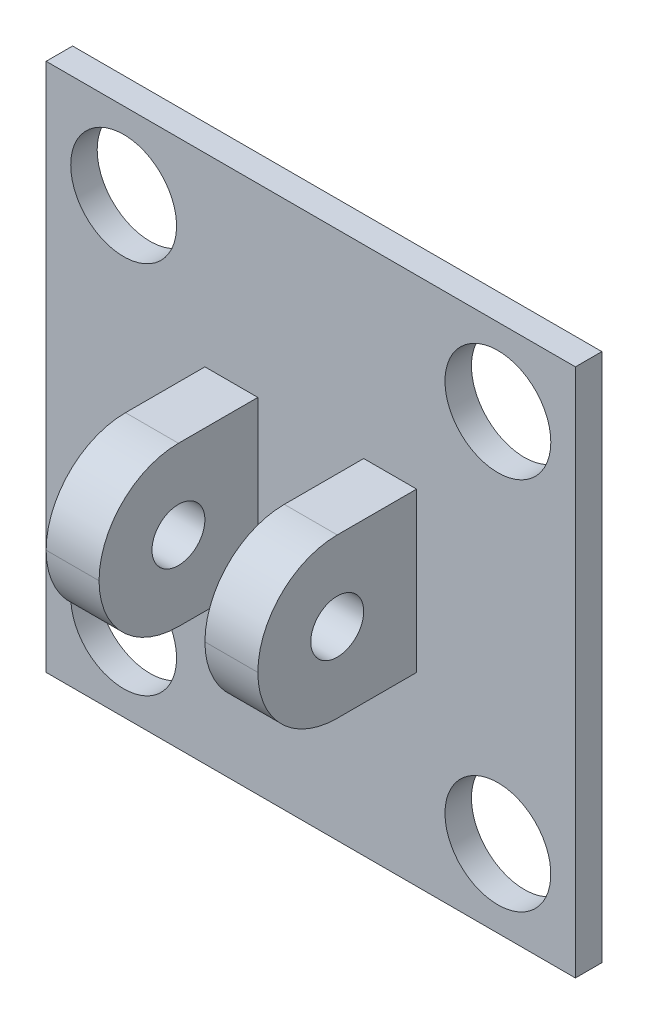
ISO-10303-21;
HEADER;
FILE_DESCRIPTION(('STEP AP214'),'2;1');
FILE_NAME('part.step','',(''),(''),'','','');
FILE_SCHEMA(('AUTOMOTIVE_DESIGN { 1 0 10303 214 1 1 1 1 }'));
ENDSEC;
DATA;
#1=APPLICATION_CONTEXT('core data for automotive mechanical design processes');
#2=APPLICATION_PROTOCOL_DEFINITION('international standard','automotive_design',2000,#1);
#3=PRODUCT_CONTEXT('',#1,'mechanical');
#4=PRODUCT('Part','Part','',(#3));
#5=PRODUCT_RELATED_PRODUCT_CATEGORY('part','',(#4));
#6=PRODUCT_DEFINITION_FORMATION('','',#4);
#7=PRODUCT_DEFINITION_CONTEXT('part definition',#1,'design');
#8=PRODUCT_DEFINITION('design','',#6,#7);
#9=PRODUCT_DEFINITION_SHAPE('','',#8);
#10=(LENGTH_UNIT() NAMED_UNIT(*) SI_UNIT(.MILLI.,.METRE.));
#11=(NAMED_UNIT(*) PLANE_ANGLE_UNIT() SI_UNIT($,.RADIAN.));
#12=(NAMED_UNIT(*) SI_UNIT($,.STERADIAN.) SOLID_ANGLE_UNIT());
#13=UNCERTAINTY_MEASURE_WITH_UNIT(LENGTH_MEASURE(1.E-05),#10,'distance_accuracy_value','');
#14=(GEOMETRIC_REPRESENTATION_CONTEXT(3) GLOBAL_UNCERTAINTY_ASSIGNED_CONTEXT((#13)) GLOBAL_UNIT_ASSIGNED_CONTEXT((#10,
#11,#12)) REPRESENTATION_CONTEXT('',''));
#15=CARTESIAN_POINT('',(0.,0.,0.));
#16=DIRECTION('',(0.,0.,1.));
#17=DIRECTION('',(1.,0.,0.));
#18=AXIS2_PLACEMENT_3D('',#15,#16,#17);
#19=CARTESIAN_POINT('',(0.,0.,2.5));
#20=DIRECTION('',(0.,0.,-1.));
#21=DIRECTION('',(-1.,0.,0.));
#22=AXIS2_PLACEMENT_3D('',#19,#20,#21);
#23=PLANE('',#22);
#24=DIRECTION('',(1.,0.,0.));
#25=VECTOR('',#24,1.);
#26=CARTESIAN_POINT('',(0.,-7.5,2.5));
#27=LINE('',#26,#25);
#28=CARTESIAN_POINT('',(5.,-7.5,2.5));
#29=VERTEX_POINT('',#28);
#30=CARTESIAN_POINT('',(10.,-7.5,2.5));
#31=VERTEX_POINT('',#30);
#32=EDGE_CURVE('E146',#29,#31,#27,.T.);
#33=ORIENTED_EDGE('',*,*,#32,.F.);
#34=DIRECTION('',(0.,1.,0.));
#35=VECTOR('',#34,1.);
#36=CARTESIAN_POINT('',(5.,0.,2.5));
#37=LINE('',#36,#35);
#38=CARTESIAN_POINT('',(5.,7.5,2.5));
#39=VERTEX_POINT('',#38);
#40=EDGE_CURVE('E155',#29,#39,#37,.T.);
#41=ORIENTED_EDGE('',*,*,#40,.T.);
#42=DIRECTION('',(1.,0.,0.));
#43=VECTOR('',#42,1.);
#44=CARTESIAN_POINT('',(0.,7.5,2.5));
#45=LINE('',#44,#43);
#46=CARTESIAN_POINT('',(10.,7.5,2.5));
#47=VERTEX_POINT('',#46);
#48=EDGE_CURVE('E170',#39,#47,#45,.T.);
#49=ORIENTED_EDGE('',*,*,#48,.T.);
#50=DIRECTION('',(0.,1.,0.));
#51=VECTOR('',#50,1.);
#52=CARTESIAN_POINT('',(10.,0.,2.5));
#53=LINE('',#52,#51);
#54=EDGE_CURVE('E166',#31,#47,#53,.T.);
#55=ORIENTED_EDGE('',*,*,#54,.F.);
#56=EDGE_LOOP('',(#33,#41,#49,#55));
#57=FACE_BOUND('',#56,.T.);
#58=CARTESIAN_POINT('',(-17.6776695296637,-17.6776695296637,2.5));
#59=DIRECTION('',(0.,0.,1.));
#60=DIRECTION('',(1.,0.,0.));
#61=AXIS2_PLACEMENT_3D('',#58,#59,#60);
#62=CIRCLE('',#61,5.);
#63=CARTESIAN_POINT('',(-12.6776695296637,-17.6776695296637,2.5));
#64=VERTEX_POINT('',#63);
#65=EDGE_CURVE('E211',#64,#64,#62,.T.);
#66=ORIENTED_EDGE('',*,*,#65,.F.);
#67=EDGE_LOOP('',(#66));
#68=FACE_BOUND('',#67,.T.);
#69=CARTESIAN_POINT('',(17.6776695296637,-17.6776695296637,2.5));
#70=DIRECTION('',(0.,0.,1.));
#71=DIRECTION('',(-1.,0.,0.));
#72=AXIS2_PLACEMENT_3D('',#69,#70,#71);
#73=CIRCLE('',#72,5.);
#74=CARTESIAN_POINT('',(12.6776695296637,-17.6776695296637,2.5));
#75=VERTEX_POINT('',#74);
#76=EDGE_CURVE('E219',#75,#75,#73,.T.);
#77=ORIENTED_EDGE('',*,*,#76,.F.);
#78=EDGE_LOOP('',(#77));
#79=FACE_BOUND('',#78,.T.);
#80=CARTESIAN_POINT('',(-17.6776695296637,17.6776695296637,2.5));
#81=DIRECTION('',(0.,0.,1.));
#82=DIRECTION('',(-1.,0.,0.));
#83=AXIS2_PLACEMENT_3D('',#80,#81,#82);
#84=CIRCLE('',#83,5.);
#85=CARTESIAN_POINT('',(-22.6776695296637,17.6776695296637,2.5));
#86=VERTEX_POINT('',#85);
#87=EDGE_CURVE('E227',#86,#86,#84,.T.);
#88=ORIENTED_EDGE('',*,*,#87,.F.);
#89=EDGE_LOOP('',(#88));
#90=FACE_BOUND('',#89,.T.);
#91=CARTESIAN_POINT('',(17.6776695296637,17.6776695296637,2.5));
#92=DIRECTION('',(0.,0.,1.));
#93=DIRECTION('',(1.,0.,0.));
#94=AXIS2_PLACEMENT_3D('',#91,#92,#93);
#95=CIRCLE('',#94,5.);
#96=CARTESIAN_POINT('',(22.6776695296637,17.6776695296637,2.5));
#97=VERTEX_POINT('',#96);
#98=EDGE_CURVE('E235',#97,#97,#95,.T.);
#99=ORIENTED_EDGE('',*,*,#98,.F.);
#100=EDGE_LOOP('',(#99));
#101=FACE_BOUND('',#100,.T.);
#102=DIRECTION('',(0.,1.,0.));
#103=VECTOR('',#102,1.);
#104=CARTESIAN_POINT('',(25.,-25.,2.5));
#105=LINE('',#104,#103);
#106=CARTESIAN_POINT('',(25.,-25.,2.5));
#107=VERTEX_POINT('',#106);
#108=CARTESIAN_POINT('',(25.,25.,2.5));
#109=VERTEX_POINT('',#108);
#110=EDGE_CURVE('E243',#107,#109,#105,.T.);
#111=ORIENTED_EDGE('',*,*,#110,.T.);
#112=DIRECTION('',(-1.,0.,0.));
#113=VECTOR('',#112,1.);
#114=CARTESIAN_POINT('',(-25.,25.,2.5));
#115=LINE('',#114,#113);
#116=CARTESIAN_POINT('',(-25.,25.,2.5));
#117=VERTEX_POINT('',#116);
#118=EDGE_CURVE('E247',#109,#117,#115,.T.);
#119=ORIENTED_EDGE('',*,*,#118,.T.);
#120=DIRECTION('',(0.,-1.,0.));
#121=VECTOR('',#120,1.);
#122=CARTESIAN_POINT('',(-25.,-25.,2.5));
#123=LINE('',#122,#121);
#124=CARTESIAN_POINT('',(-25.,-25.,2.5));
#125=VERTEX_POINT('',#124);
#126=EDGE_CURVE('E251',#117,#125,#123,.T.);
#127=ORIENTED_EDGE('',*,*,#126,.T.);
#128=DIRECTION('',(1.,0.,0.));
#129=VECTOR('',#128,1.);
#130=CARTESIAN_POINT('',(-25.,-25.,2.5));
#131=LINE('',#130,#129);
#132=EDGE_CURVE('E254',#125,#107,#131,.T.);
#133=ORIENTED_EDGE('',*,*,#132,.T.);
#134=EDGE_LOOP('',(#111,#119,#127,#133));
#135=FACE_BOUND('',#134,.T.);
#136=DIRECTION('',(1.,0.,0.));
#137=VECTOR('',#136,1.);
#138=CARTESIAN_POINT('',(0.,-7.5,2.5));
#139=LINE('',#138,#137);
#140=CARTESIAN_POINT('',(-10.,-7.5,2.5));
#141=VERTEX_POINT('',#140);
#142=CARTESIAN_POINT('',(-5.,-7.5,2.5));
#143=VERTEX_POINT('',#142);
#144=EDGE_CURVE('E151',#141,#143,#139,.T.);
#145=ORIENTED_EDGE('',*,*,#144,.F.);
#146=DIRECTION('',(0.,1.,0.));
#147=VECTOR('',#146,1.);
#148=CARTESIAN_POINT('',(-10.,0.,2.5));
#149=LINE('',#148,#147);
#150=CARTESIAN_POINT('',(-10.,7.5,2.5));
#151=VERTEX_POINT('',#150);
#152=EDGE_CURVE('E194',#141,#151,#149,.T.);
#153=ORIENTED_EDGE('',*,*,#152,.T.);
#154=DIRECTION('',(1.,0.,0.));
#155=VECTOR('',#154,1.);
#156=CARTESIAN_POINT('',(0.,7.5,2.5));
#157=LINE('',#156,#155);
#158=CARTESIAN_POINT('',(-5.,7.5,2.5));
#159=VERTEX_POINT('',#158);
#160=EDGE_CURVE('E190',#151,#159,#157,.T.);
#161=ORIENTED_EDGE('',*,*,#160,.T.);
#162=DIRECTION('',(0.,1.,0.));
#163=VECTOR('',#162,1.);
#164=CARTESIAN_POINT('',(-5.,0.,2.5));
#165=LINE('',#164,#163);
#166=EDGE_CURVE('E186',#143,#159,#165,.T.);
#167=ORIENTED_EDGE('',*,*,#166,.F.);
#168=EDGE_LOOP('',(#145,#153,#161,#167));
#169=FACE_BOUND('',#168,.T.);
#170=ADVANCED_FACE('F41',(#57,#68,#79,#90,#101,#135,#169),#23,.F.);
#171=CARTESIAN_POINT('',(0.,0.,0.));
#172=DIRECTION('',(0.,0.,-1.));
#173=DIRECTION('',(-1.,0.,0.));
#174=AXIS2_PLACEMENT_3D('',#171,#172,#173);
#175=PLANE('',#174);
#176=CARTESIAN_POINT('',(17.6776695296637,-17.6776695296637,0.));
#177=DIRECTION('',(0.,0.,1.));
#178=DIRECTION('',(-1.,0.,0.));
#179=AXIS2_PLACEMENT_3D('',#176,#177,#178);
#180=CIRCLE('',#179,5.);
#181=CARTESIAN_POINT('',(12.6776695296637,-17.6776695296637,0.));
#182=VERTEX_POINT('',#181);
#183=EDGE_CURVE('E215',#182,#182,#180,.T.);
#184=ORIENTED_EDGE('',*,*,#183,.T.);
#185=EDGE_LOOP('',(#184));
#186=FACE_BOUND('',#185,.T.);
#187=CARTESIAN_POINT('',(17.6776695296637,17.6776695296637,0.));
#188=DIRECTION('',(0.,0.,1.));
#189=DIRECTION('',(1.,0.,0.));
#190=AXIS2_PLACEMENT_3D('',#187,#188,#189);
#191=CIRCLE('',#190,5.);
#192=CARTESIAN_POINT('',(22.6776695296637,17.6776695296637,0.));
#193=VERTEX_POINT('',#192);
#194=EDGE_CURVE('E231',#193,#193,#191,.T.);
#195=ORIENTED_EDGE('',*,*,#194,.T.);
#196=EDGE_LOOP('',(#195));
#197=FACE_BOUND('',#196,.T.);
#198=DIRECTION('',(0.,1.,0.));
#199=VECTOR('',#198,1.);
#200=CARTESIAN_POINT('',(25.,-25.,0.));
#201=LINE('',#200,#199);
#202=CARTESIAN_POINT('',(25.,-25.,0.));
#203=VERTEX_POINT('',#202);
#204=CARTESIAN_POINT('',(25.,25.,0.));
#205=VERTEX_POINT('',#204);
#206=EDGE_CURVE('E239',#203,#205,#201,.T.);
#207=ORIENTED_EDGE('',*,*,#206,.F.);
#208=DIRECTION('',(1.,0.,0.));
#209=VECTOR('',#208,1.);
#210=CARTESIAN_POINT('',(-25.,-25.,0.));
#211=LINE('',#210,#209);
#212=CARTESIAN_POINT('',(-25.,-25.,0.));
#213=VERTEX_POINT('',#212);
#214=EDGE_CURVE('E248',#213,#203,#211,.T.);
#215=ORIENTED_EDGE('',*,*,#214,.F.);
#216=DIRECTION('',(0.,-1.,0.));
#217=VECTOR('',#216,1.);
#218=CARTESIAN_POINT('',(-25.,-25.,0.));
#219=LINE('',#218,#217);
#220=CARTESIAN_POINT('',(-25.,25.,0.));
#221=VERTEX_POINT('',#220);
#222=EDGE_CURVE('E264',#221,#213,#219,.T.);
#223=ORIENTED_EDGE('',*,*,#222,.F.);
#224=DIRECTION('',(-1.,0.,0.));
#225=VECTOR('',#224,1.);
#226=CARTESIAN_POINT('',(-25.,25.,0.));
#227=LINE('',#226,#225);
#228=EDGE_CURVE('E261',#205,#221,#227,.T.);
#229=ORIENTED_EDGE('',*,*,#228,.F.);
#230=EDGE_LOOP('',(#207,#215,#223,#229));
#231=FACE_BOUND('',#230,.T.);
#232=CARTESIAN_POINT('',(-17.6776695296637,17.6776695296637,0.));
#233=DIRECTION('',(0.,0.,1.));
#234=DIRECTION('',(-1.,0.,0.));
#235=AXIS2_PLACEMENT_3D('',#232,#233,#234);
#236=CIRCLE('',#235,5.);
#237=CARTESIAN_POINT('',(-22.6776695296637,17.6776695296637,0.));
#238=VERTEX_POINT('',#237);
#239=EDGE_CURVE('E223',#238,#238,#236,.T.);
#240=ORIENTED_EDGE('',*,*,#239,.T.);
#241=EDGE_LOOP('',(#240));
#242=FACE_BOUND('',#241,.T.);
#243=CARTESIAN_POINT('',(-17.6776695296637,-17.6776695296637,0.));
#244=DIRECTION('',(0.,0.,1.));
#245=DIRECTION('',(1.,0.,0.));
#246=AXIS2_PLACEMENT_3D('',#243,#244,#245);
#247=CIRCLE('',#246,5.);
#248=CARTESIAN_POINT('',(-12.6776695296637,-17.6776695296637,0.));
#249=VERTEX_POINT('',#248);
#250=EDGE_CURVE('E210',#249,#249,#247,.T.);
#251=ORIENTED_EDGE('',*,*,#250,.T.);
#252=EDGE_LOOP('',(#251));
#253=FACE_BOUND('',#252,.T.);
#254=ADVANCED_FACE('F351',(#186,#197,#231,#242,#253),#175,.T.);
#255=CARTESIAN_POINT('',(25.,-25.,2.5));
#256=DIRECTION('',(-1.,0.,0.));
#257=DIRECTION('',(0.,-1.,0.));
#258=AXIS2_PLACEMENT_3D('',#255,#256,#257);
#259=PLANE('',#258);
#260=ORIENTED_EDGE('',*,*,#206,.T.);
#261=DIRECTION('',(0.,0.,-1.));
#262=VECTOR('',#261,1.);
#263=CARTESIAN_POINT('',(25.,25.,2.5));
#264=LINE('',#263,#262);
#265=EDGE_CURVE('E280',#109,#205,#264,.T.);
#266=ORIENTED_EDGE('',*,*,#265,.F.);
#267=ORIENTED_EDGE('',*,*,#110,.F.);
#268=DIRECTION('',(0.,0.,-1.));
#269=VECTOR('',#268,1.);
#270=CARTESIAN_POINT('',(25.,-25.,2.5));
#271=LINE('',#270,#269);
#272=EDGE_CURVE('E257',#107,#203,#271,.T.);
#273=ORIENTED_EDGE('',*,*,#272,.T.);
#274=EDGE_LOOP('',(#260,#266,#267,#273));
#275=FACE_BOUND('',#274,.T.);
#276=ADVANCED_FACE('F356',(#275),#259,.F.);
#277=CARTESIAN_POINT('',(-25.,25.,2.5));
#278=DIRECTION('',(0.,-1.,0.));
#279=DIRECTION('',(1.,0.,0.));
#280=AXIS2_PLACEMENT_3D('',#277,#278,#279);
#281=PLANE('',#280);
#282=ORIENTED_EDGE('',*,*,#228,.T.);
#283=DIRECTION('',(0.,0.,-1.));
#284=VECTOR('',#283,1.);
#285=CARTESIAN_POINT('',(-25.,25.,2.5));
#286=LINE('',#285,#284);
#287=EDGE_CURVE('E276',#117,#221,#286,.T.);
#288=ORIENTED_EDGE('',*,*,#287,.F.);
#289=ORIENTED_EDGE('',*,*,#118,.F.);
#290=ORIENTED_EDGE('',*,*,#265,.T.);
#291=EDGE_LOOP('',(#282,#288,#289,#290));
#292=FACE_BOUND('',#291,.T.);
#293=ADVANCED_FACE('F370',(#292),#281,.F.);
#294=CARTESIAN_POINT('',(-25.,-25.,2.5));
#295=DIRECTION('',(1.,0.,0.));
#296=DIRECTION('',(0.,1.,0.));
#297=AXIS2_PLACEMENT_3D('',#294,#295,#296);
#298=PLANE('',#297);
#299=ORIENTED_EDGE('',*,*,#222,.T.);
#300=DIRECTION('',(0.,0.,-1.));
#301=VECTOR('',#300,1.);
#302=CARTESIAN_POINT('',(-25.,-25.,2.5));
#303=LINE('',#302,#301);
#304=EDGE_CURVE('E272',#125,#213,#303,.T.);
#305=ORIENTED_EDGE('',*,*,#304,.F.);
#306=ORIENTED_EDGE('',*,*,#126,.F.);
#307=ORIENTED_EDGE('',*,*,#287,.T.);
#308=EDGE_LOOP('',(#299,#305,#306,#307));
#309=FACE_BOUND('',#308,.T.);
#310=ADVANCED_FACE('F366',(#309),#298,.F.);
#311=CARTESIAN_POINT('',(-25.,-25.,2.5));
#312=DIRECTION('',(0.,1.,0.));
#313=DIRECTION('',(0.,0.,1.));
#314=AXIS2_PLACEMENT_3D('',#311,#312,#313);
#315=PLANE('',#314);
#316=ORIENTED_EDGE('',*,*,#214,.T.);
#317=ORIENTED_EDGE('',*,*,#272,.F.);
#318=ORIENTED_EDGE('',*,*,#132,.F.);
#319=ORIENTED_EDGE('',*,*,#304,.T.);
#320=EDGE_LOOP('',(#316,#317,#318,#319));
#321=FACE_BOUND('',#320,.T.);
#322=ADVANCED_FACE('F363',(#321),#315,.F.);
#323=CARTESIAN_POINT('',(17.6776695296637,17.6776695296637,2.5));
#324=DIRECTION('',(0.,0.,-1.));
#325=DIRECTION('',(-1.,0.,0.));
#326=AXIS2_PLACEMENT_3D('',#323,#324,#325);
#327=CYLINDRICAL_SURFACE('',#326,5.);
#328=ORIENTED_EDGE('',*,*,#98,.T.);
#329=EDGE_LOOP('',(#328));
#330=FACE_BOUND('',#329,.T.);
#331=ORIENTED_EDGE('',*,*,#194,.F.);
#332=EDGE_LOOP('',(#331));
#333=FACE_BOUND('',#332,.T.);
#334=ADVANCED_FACE('F360',(#330,#333),#327,.F.);
#335=CARTESIAN_POINT('',(-17.6776695296637,17.6776695296637,2.5));
#336=DIRECTION('',(0.,0.,-1.));
#337=DIRECTION('',(-1.,0.,0.));
#338=AXIS2_PLACEMENT_3D('',#335,#336,#337);
#339=CYLINDRICAL_SURFACE('',#338,5.);
#340=ORIENTED_EDGE('',*,*,#87,.T.);
#341=EDGE_LOOP('',(#340));
#342=FACE_BOUND('',#341,.T.);
#343=ORIENTED_EDGE('',*,*,#239,.F.);
#344=EDGE_LOOP('',(#343));
#345=FACE_BOUND('',#344,.T.);
#346=ADVANCED_FACE('F493',(#342,#345),#339,.F.);
#347=CARTESIAN_POINT('',(17.6776695296637,-17.6776695296637,2.5));
#348=DIRECTION('',(0.,0.,-1.));
#349=DIRECTION('',(-1.,0.,0.));
#350=AXIS2_PLACEMENT_3D('',#347,#348,#349);
#351=CYLINDRICAL_SURFACE('',#350,5.);
#352=ORIENTED_EDGE('',*,*,#76,.T.);
#353=EDGE_LOOP('',(#352));
#354=FACE_BOUND('',#353,.T.);
#355=ORIENTED_EDGE('',*,*,#183,.F.);
#356=EDGE_LOOP('',(#355));
#357=FACE_BOUND('',#356,.T.);
#358=ADVANCED_FACE('F485',(#354,#357),#351,.F.);
#359=CARTESIAN_POINT('',(-17.6776695296637,-17.6776695296637,2.5));
#360=DIRECTION('',(0.,0.,-1.));
#361=DIRECTION('',(-1.,0.,0.));
#362=AXIS2_PLACEMENT_3D('',#359,#360,#361);
#363=CYLINDRICAL_SURFACE('',#362,5.);
#364=ORIENTED_EDGE('',*,*,#65,.T.);
#365=EDGE_LOOP('',(#364));
#366=FACE_BOUND('',#365,.T.);
#367=ORIENTED_EDGE('',*,*,#250,.F.);
#368=EDGE_LOOP('',(#367));
#369=FACE_BOUND('',#368,.T.);
#370=ADVANCED_FACE('F474',(#366,#369),#363,.F.);
#371=CARTESIAN_POINT('',(0.,-7.5,17.5));
#372=DIRECTION('',(0.,1.,0.));
#373=DIRECTION('',(0.,0.,1.));
#374=AXIS2_PLACEMENT_3D('',#371,#372,#373);
#375=PLANE('',#374);
#376=DIRECTION('',(0.,0.,-1.));
#377=VECTOR('',#376,1.);
#378=CARTESIAN_POINT('',(-5.,-7.5,17.5));
#379=LINE('',#378,#377);
#380=CARTESIAN_POINT('',(-5.,-7.5,10.));
#381=VERTEX_POINT('',#380);
#382=EDGE_CURVE('E207',#381,#143,#379,.T.);
#383=ORIENTED_EDGE('',*,*,#382,.F.);
#384=DIRECTION('',(1.,0.,0.));
#385=VECTOR('',#384,1.);
#386=CARTESIAN_POINT('',(-10.,-7.5,10.));
#387=LINE('',#386,#385);
#388=CARTESIAN_POINT('',(-10.,-7.5,10.));
#389=VERTEX_POINT('',#388);
#390=EDGE_CURVE('E300',#381,#389,#387,.F.);
#391=ORIENTED_EDGE('',*,*,#390,.T.);
#392=DIRECTION('',(0.,0.,-1.));
#393=VECTOR('',#392,1.);
#394=CARTESIAN_POINT('',(-10.,-7.5,17.5));
#395=LINE('',#394,#393);
#396=EDGE_CURVE('E198',#389,#141,#395,.T.);
#397=ORIENTED_EDGE('',*,*,#396,.T.);
#398=ORIENTED_EDGE('',*,*,#144,.T.);
#399=EDGE_LOOP('',(#383,#391,#397,#398));
#400=FACE_BOUND('',#399,.T.);
#401=ADVANCED_FACE('F465',(#400),#375,.F.);
#402=CARTESIAN_POINT('',(-5.,0.,17.5));
#403=DIRECTION('',(-1.,0.,0.));
#404=DIRECTION('',(0.,0.,1.));
#405=AXIS2_PLACEMENT_3D('',#402,#403,#404);
#406=PLANE('',#405);
#407=CARTESIAN_POINT('',(-5.,0.,10.));
#408=DIRECTION('',(-1.,0.,0.));
#409=DIRECTION('',(0.,0.,1.));
#410=AXIS2_PLACEMENT_3D('',#407,#408,#409);
#411=CIRCLE('',#410,2.5);
#412=CARTESIAN_POINT('',(-5.,0.,12.5));
#413=VERTEX_POINT('',#412);
#414=EDGE_CURVE('E162',#413,#413,#411,.T.);
#415=ORIENTED_EDGE('',*,*,#414,.T.);
#416=EDGE_LOOP('',(#415));
#417=FACE_BOUND('',#416,.T.);
#418=DIRECTION('',(0.,0.,-1.));
#419=VECTOR('',#418,1.);
#420=CARTESIAN_POINT('',(-5.,7.5,17.5));
#421=LINE('',#420,#419);
#422=CARTESIAN_POINT('',(-5.,7.5,10.));
#423=VERTEX_POINT('',#422);
#424=EDGE_CURVE('E204',#423,#159,#421,.T.);
#425=ORIENTED_EDGE('',*,*,#424,.F.);
#426=CARTESIAN_POINT('',(-5.,0.,10.));
#427=DIRECTION('',(-1.,0.,0.));
#428=DIRECTION('',(0.,0.,1.));
#429=AXIS2_PLACEMENT_3D('',#426,#427,#428);
#430=CIRCLE('',#429,7.5);
#431=CARTESIAN_POINT('',(-5.,0.,17.5));
#432=VERTEX_POINT('',#431);
#433=EDGE_CURVE('E291',#423,#432,#430,.F.);
#434=ORIENTED_EDGE('',*,*,#433,.T.);
#435=CARTESIAN_POINT('',(-5.,0.,10.));
#436=DIRECTION('',(-1.,0.,0.));
#437=DIRECTION('',(0.,0.,1.));
#438=AXIS2_PLACEMENT_3D('',#435,#436,#437);
#439=CIRCLE('',#438,7.5);
#440=EDGE_CURVE('E288',#432,#381,#439,.F.);
#441=ORIENTED_EDGE('',*,*,#440,.T.);
#442=ORIENTED_EDGE('',*,*,#382,.T.);
#443=ORIENTED_EDGE('',*,*,#166,.T.);
#444=EDGE_LOOP('',(#425,#434,#441,#442,#443));
#445=FACE_BOUND('',#444,.T.);
#446=ADVANCED_FACE('F456',(#417,#445),#406,.F.);
#447=CARTESIAN_POINT('',(0.,7.5,17.5));
#448=DIRECTION('',(0.,1.,0.));
#449=DIRECTION('',(0.,0.,1.));
#450=AXIS2_PLACEMENT_3D('',#447,#448,#449);
#451=PLANE('',#450);
#452=DIRECTION('',(0.,0.,-1.));
#453=VECTOR('',#452,1.);
#454=CARTESIAN_POINT('',(-10.,7.5,17.5));
#455=LINE('',#454,#453);
#456=CARTESIAN_POINT('',(-10.,7.5,10.));
#457=VERTEX_POINT('',#456);
#458=EDGE_CURVE('E201',#457,#151,#455,.T.);
#459=ORIENTED_EDGE('',*,*,#458,.F.);
#460=DIRECTION('',(1.,0.,0.));
#461=VECTOR('',#460,1.);
#462=CARTESIAN_POINT('',(0.,7.5,10.));
#463=LINE('',#462,#461);
#464=EDGE_CURVE('E284',#457,#423,#463,.T.);
#465=ORIENTED_EDGE('',*,*,#464,.T.);
#466=ORIENTED_EDGE('',*,*,#424,.T.);
#467=ORIENTED_EDGE('',*,*,#160,.F.);
#468=EDGE_LOOP('',(#459,#465,#466,#467));
#469=FACE_BOUND('',#468,.T.);
#470=ADVANCED_FACE('F446',(#469),#451,.T.);
#471=CARTESIAN_POINT('',(-10.,0.,17.5));
#472=DIRECTION('',(-1.,0.,0.));
#473=DIRECTION('',(0.,0.,1.));
#474=AXIS2_PLACEMENT_3D('',#471,#472,#473);
#475=PLANE('',#474);
#476=CARTESIAN_POINT('',(-10.,0.,10.));
#477=DIRECTION('',(-1.,0.,0.));
#478=DIRECTION('',(0.,0.,1.));
#479=AXIS2_PLACEMENT_3D('',#476,#477,#478);
#480=CIRCLE('',#479,2.5);
#481=CARTESIAN_POINT('',(-10.,0.,12.5));
#482=VERTEX_POINT('',#481);
#483=EDGE_CURVE('E599',#482,#482,#480,.T.);
#484=ORIENTED_EDGE('',*,*,#483,.F.);
#485=EDGE_LOOP('',(#484));
#486=FACE_BOUND('',#485,.T.);
#487=CARTESIAN_POINT('',(-10.,0.,10.));
#488=DIRECTION('',(-1.,0.,0.));
#489=DIRECTION('',(0.,0.,1.));
#490=AXIS2_PLACEMENT_3D('',#487,#488,#489);
#491=CIRCLE('',#490,7.5);
#492=CARTESIAN_POINT('',(-10.,0.,17.5));
#493=VERTEX_POINT('',#492);
#494=EDGE_CURVE('E294',#389,#493,#491,.T.);
#495=ORIENTED_EDGE('',*,*,#494,.T.);
#496=CARTESIAN_POINT('',(-10.,0.,10.));
#497=DIRECTION('',(-1.,0.,0.));
#498=DIRECTION('',(0.,0.,1.));
#499=AXIS2_PLACEMENT_3D('',#496,#497,#498);
#500=CIRCLE('',#499,7.5);
#501=EDGE_CURVE('E297',#493,#457,#500,.T.);
#502=ORIENTED_EDGE('',*,*,#501,.T.);
#503=ORIENTED_EDGE('',*,*,#458,.T.);
#504=ORIENTED_EDGE('',*,*,#152,.F.);
#505=ORIENTED_EDGE('',*,*,#396,.F.);
#506=EDGE_LOOP('',(#495,#502,#503,#504,#505));
#507=FACE_BOUND('',#506,.T.);
#508=ADVANCED_FACE('F436',(#486,#507),#475,.T.);
#509=CARTESIAN_POINT('',(5.,0.,17.5));
#510=DIRECTION('',(-1.,0.,0.));
#511=DIRECTION('',(0.,0.,1.));
#512=AXIS2_PLACEMENT_3D('',#509,#510,#511);
#513=PLANE('',#512);
#514=CARTESIAN_POINT('',(5.,0.,10.));
#515=DIRECTION('',(-1.,0.,0.));
#516=DIRECTION('',(0.,0.,1.));
#517=AXIS2_PLACEMENT_3D('',#514,#515,#516);
#518=CIRCLE('',#517,2.5);
#519=CARTESIAN_POINT('',(5.,0.,12.5));
#520=VERTEX_POINT('',#519);
#521=EDGE_CURVE('E324',#520,#520,#518,.T.);
#522=ORIENTED_EDGE('',*,*,#521,.F.);
#523=EDGE_LOOP('',(#522));
#524=FACE_BOUND('',#523,.T.);
#525=DIRECTION('',(0.,0.,-1.));
#526=VECTOR('',#525,1.);
#527=CARTESIAN_POINT('',(5.,-7.5,17.5));
#528=LINE('',#527,#526);
#529=CARTESIAN_POINT('',(5.,-7.5,10.));
#530=VERTEX_POINT('',#529);
#531=EDGE_CURVE('E141',#530,#29,#528,.T.);
#532=ORIENTED_EDGE('',*,*,#531,.F.);
#533=CARTESIAN_POINT('',(5.,0.,10.));
#534=DIRECTION('',(-1.,0.,0.));
#535=DIRECTION('',(0.,0.,1.));
#536=AXIS2_PLACEMENT_3D('',#533,#534,#535);
#537=CIRCLE('',#536,7.5);
#538=CARTESIAN_POINT('',(5.,0.,17.5));
#539=VERTEX_POINT('',#538);
#540=EDGE_CURVE('E51',#530,#539,#537,.T.);
#541=ORIENTED_EDGE('',*,*,#540,.T.);
#542=CARTESIAN_POINT('',(5.,0.,10.));
#543=DIRECTION('',(-1.,0.,0.));
#544=DIRECTION('',(0.,0.,1.));
#545=AXIS2_PLACEMENT_3D('',#542,#543,#544);
#546=CIRCLE('',#545,7.5);
#547=CARTESIAN_POINT('',(5.,7.5,10.));
#548=VERTEX_POINT('',#547);
#549=EDGE_CURVE('E59',#539,#548,#546,.T.);
#550=ORIENTED_EDGE('',*,*,#549,.T.);
#551=DIRECTION('',(0.,0.,-1.));
#552=VECTOR('',#551,1.);
#553=CARTESIAN_POINT('',(5.,7.5,17.5));
#554=LINE('',#553,#552);
#555=EDGE_CURVE('E157',#548,#39,#554,.T.);
#556=ORIENTED_EDGE('',*,*,#555,.T.);
#557=ORIENTED_EDGE('',*,*,#40,.F.);
#558=EDGE_LOOP('',(#532,#541,#550,#556,#557));
#559=FACE_BOUND('',#558,.T.);
#560=ADVANCED_FACE('F156',(#524,#559),#513,.T.);
#561=CARTESIAN_POINT('',(0.,-7.5,17.5));
#562=DIRECTION('',(0.,1.,0.));
#563=DIRECTION('',(0.,0.,1.));
#564=AXIS2_PLACEMENT_3D('',#561,#562,#563);
#565=PLANE('',#564);
#566=DIRECTION('',(0.,0.,-1.));
#567=VECTOR('',#566,1.);
#568=CARTESIAN_POINT('',(10.,-7.5,17.5));
#569=LINE('',#568,#567);
#570=CARTESIAN_POINT('',(10.,-7.5,10.));
#571=VERTEX_POINT('',#570);
#572=EDGE_CURVE('E152',#571,#31,#569,.T.);
#573=ORIENTED_EDGE('',*,*,#572,.F.);
#574=DIRECTION('',(1.,0.,0.));
#575=VECTOR('',#574,1.);
#576=CARTESIAN_POINT('',(5.,-7.5,10.));
#577=LINE('',#576,#575);
#578=EDGE_CURVE('E149',#571,#530,#577,.F.);
#579=ORIENTED_EDGE('',*,*,#578,.T.);
#580=ORIENTED_EDGE('',*,*,#531,.T.);
#581=ORIENTED_EDGE('',*,*,#32,.T.);
#582=EDGE_LOOP('',(#573,#579,#580,#581));
#583=FACE_BOUND('',#582,.T.);
#584=ADVANCED_FACE('F144',(#583),#565,.F.);
#585=CARTESIAN_POINT('',(10.,0.,17.5));
#586=DIRECTION('',(-1.,0.,0.));
#587=DIRECTION('',(0.,0.,1.));
#588=AXIS2_PLACEMENT_3D('',#585,#586,#587);
#589=PLANE('',#588);
#590=CARTESIAN_POINT('',(10.,0.,10.));
#591=DIRECTION('',(1.,0.,0.));
#592=DIRECTION('',(0.,0.,-1.));
#593=AXIS2_PLACEMENT_3D('',#590,#591,#592);
#594=CIRCLE('',#593,2.5);
#595=CARTESIAN_POINT('',(10.,0.,7.5));
#596=VERTEX_POINT('',#595);
#597=EDGE_CURVE('E317',#596,#596,#594,.T.);
#598=ORIENTED_EDGE('',*,*,#597,.F.);
#599=EDGE_LOOP('',(#598));
#600=FACE_BOUND('',#599,.T.);
#601=CARTESIAN_POINT('',(10.,0.,10.));
#602=DIRECTION('',(-1.,0.,0.));
#603=DIRECTION('',(0.,0.,1.));
#604=AXIS2_PLACEMENT_3D('',#601,#602,#603);
#605=CIRCLE('',#604,7.5);
#606=CARTESIAN_POINT('',(10.,7.5,10.));
#607=VERTEX_POINT('',#606);
#608=CARTESIAN_POINT('',(10.,0.,17.5));
#609=VERTEX_POINT('',#608);
#610=EDGE_CURVE('E303',#607,#609,#605,.F.);
#611=ORIENTED_EDGE('',*,*,#610,.T.);
#612=CARTESIAN_POINT('',(10.,0.,10.));
#613=DIRECTION('',(-1.,0.,0.));
#614=DIRECTION('',(0.,0.,1.));
#615=AXIS2_PLACEMENT_3D('',#612,#613,#614);
#616=CIRCLE('',#615,7.5);
#617=EDGE_CURVE('E306',#609,#571,#616,.F.);
#618=ORIENTED_EDGE('',*,*,#617,.T.);
#619=ORIENTED_EDGE('',*,*,#572,.T.);
#620=ORIENTED_EDGE('',*,*,#54,.T.);
#621=DIRECTION('',(0.,0.,-1.));
#622=VECTOR('',#621,1.);
#623=CARTESIAN_POINT('',(10.,7.5,17.5));
#624=LINE('',#623,#622);
#625=EDGE_CURVE('E178',#607,#47,#624,.T.);
#626=ORIENTED_EDGE('',*,*,#625,.F.);
#627=EDGE_LOOP('',(#611,#618,#619,#620,#626));
#628=FACE_BOUND('',#627,.T.);
#629=ADVANCED_FACE('F338',(#600,#628),#589,.F.);
#630=CARTESIAN_POINT('',(0.,7.5,17.5));
#631=DIRECTION('',(0.,1.,0.));
#632=DIRECTION('',(0.,0.,1.));
#633=AXIS2_PLACEMENT_3D('',#630,#631,#632);
#634=PLANE('',#633);
#635=ORIENTED_EDGE('',*,*,#555,.F.);
#636=DIRECTION('',(1.,0.,0.));
#637=VECTOR('',#636,1.);
#638=CARTESIAN_POINT('',(0.,7.5,10.));
#639=LINE('',#638,#637);
#640=EDGE_CURVE('E11',#548,#607,#639,.T.);
#641=ORIENTED_EDGE('',*,*,#640,.T.);
#642=ORIENTED_EDGE('',*,*,#625,.T.);
#643=ORIENTED_EDGE('',*,*,#48,.F.);
#644=EDGE_LOOP('',(#635,#641,#642,#643));
#645=FACE_BOUND('',#644,.T.);
#646=ADVANCED_FACE('F336',(#645),#634,.T.);
#647=CARTESIAN_POINT('',(-25.,0.,10.));
#648=DIRECTION('',(1.,0.,0.));
#649=DIRECTION('',(0.,0.,-1.));
#650=AXIS2_PLACEMENT_3D('',#647,#648,#649);
#651=CYLINDRICAL_SURFACE('',#650,2.5);
#652=ORIENTED_EDGE('',*,*,#521,.T.);
#653=EDGE_LOOP('',(#652));
#654=FACE_BOUND('',#653,.T.);
#655=ORIENTED_EDGE('',*,*,#597,.T.);
#656=EDGE_LOOP('',(#655));
#657=FACE_BOUND('',#656,.T.);
#658=ADVANCED_FACE('F346',(#654,#657),#651,.F.);
#659=ORIENTED_EDGE('',*,*,#483,.T.);
#660=EDGE_LOOP('',(#659));
#661=FACE_BOUND('',#660,.T.);
#662=ORIENTED_EDGE('',*,*,#414,.F.);
#663=EDGE_LOOP('',(#662));
#664=FACE_BOUND('',#663,.T.);
#665=ADVANCED_FACE('F383',(#661,#664),#651,.F.);
#666=CARTESIAN_POINT('',(0.,0.,10.));
#667=DIRECTION('',(-1.,0.,0.));
#668=DIRECTION('',(0.,0.,1.));
#669=AXIS2_PLACEMENT_3D('',#666,#667,#668);
#670=CYLINDRICAL_SURFACE('',#669,7.5);
#671=DIRECTION('',(1.,0.,0.));
#672=VECTOR('',#671,1.);
#673=CARTESIAN_POINT('',(-5.,0.,17.5));
#674=LINE('',#673,#672);
#675=EDGE_CURVE('E314',#493,#432,#674,.T.);
#676=ORIENTED_EDGE('',*,*,#675,.F.);
#677=ORIENTED_EDGE('',*,*,#494,.F.);
#678=ORIENTED_EDGE('',*,*,#390,.F.);
#679=ORIENTED_EDGE('',*,*,#440,.F.);
#680=EDGE_LOOP('',(#676,#677,#678,#679));
#681=FACE_BOUND('',#680,.T.);
#682=ADVANCED_FACE('F381',(#681),#670,.T.);
#683=CARTESIAN_POINT('',(0.,0.,10.));
#684=DIRECTION('',(1.,0.,0.));
#685=DIRECTION('',(0.,0.,-1.));
#686=AXIS2_PLACEMENT_3D('',#683,#684,#685);
#687=CYLINDRICAL_SURFACE('',#686,7.5);
#688=ORIENTED_EDGE('',*,*,#501,.F.);
#689=ORIENTED_EDGE('',*,*,#675,.T.);
#690=ORIENTED_EDGE('',*,*,#433,.F.);
#691=ORIENTED_EDGE('',*,*,#464,.F.);
#692=EDGE_LOOP('',(#688,#689,#690,#691));
#693=FACE_BOUND('',#692,.T.);
#694=ADVANCED_FACE('F378',(#693),#687,.T.);
#695=CARTESIAN_POINT('',(0.,0.,10.));
#696=DIRECTION('',(1.,0.,0.));
#697=DIRECTION('',(0.,0.,-1.));
#698=AXIS2_PLACEMENT_3D('',#695,#696,#697);
#699=CYLINDRICAL_SURFACE('',#698,7.5);
#700=ORIENTED_EDGE('',*,*,#640,.F.);
#701=ORIENTED_EDGE('',*,*,#549,.F.);
#702=DIRECTION('',(1.,0.,0.));
#703=VECTOR('',#702,1.);
#704=CARTESIAN_POINT('',(0.,0.,17.5));
#705=LINE('',#704,#703);
#706=EDGE_CURVE('E45',#609,#539,#705,.F.);
#707=ORIENTED_EDGE('',*,*,#706,.F.);
#708=ORIENTED_EDGE('',*,*,#610,.F.);
#709=EDGE_LOOP('',(#700,#701,#707,#708));
#710=FACE_BOUND('',#709,.T.);
#711=ADVANCED_FACE('F43',(#710),#699,.T.);
#712=CARTESIAN_POINT('',(0.,0.,10.));
#713=DIRECTION('',(-1.,0.,0.));
#714=DIRECTION('',(0.,0.,1.));
#715=AXIS2_PLACEMENT_3D('',#712,#713,#714);
#716=CYLINDRICAL_SURFACE('',#715,7.5);
#717=ORIENTED_EDGE('',*,*,#540,.F.);
#718=ORIENTED_EDGE('',*,*,#578,.F.);
#719=ORIENTED_EDGE('',*,*,#617,.F.);
#720=ORIENTED_EDGE('',*,*,#706,.T.);
#721=EDGE_LOOP('',(#717,#718,#719,#720));
#722=FACE_BOUND('',#721,.T.);
#723=ADVANCED_FACE('F330',(#722),#716,.T.);
#724=CLOSED_SHELL('',(#170,#254,#276,#293,#310,#322,#334,#346,#358,#370,#401,#446,#470,#508,
#560,#584,#629,#646,#658,#665,#682,#694,#711,#723));
#725=MANIFOLD_SOLID_BREP('B2',#724);
#726=ADVANCED_BREP_SHAPE_REPRESENTATION('',(#18,#725),#14);
#727=SHAPE_DEFINITION_REPRESENTATION(#9,#726);
ENDSEC;
END-ISO-10303-21;
